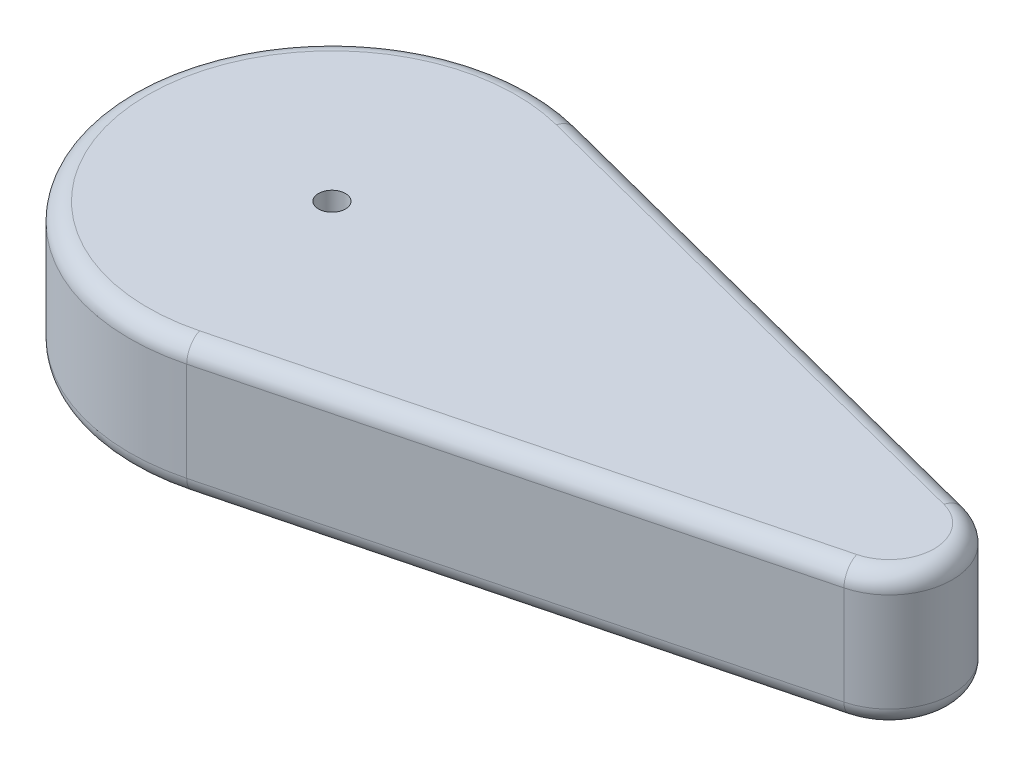
ISO-10303-21;
HEADER;
FILE_DESCRIPTION(('STEP AP214'),'2;1');
FILE_NAME('part.step','',(''),(''),'','','');
FILE_SCHEMA(('AUTOMOTIVE_DESIGN { 1 0 10303 214 1 1 1 1 }'));
ENDSEC;
DATA;
#1=APPLICATION_CONTEXT('core data for automotive mechanical design processes');
#2=APPLICATION_PROTOCOL_DEFINITION('international standard','automotive_design',2000,#1);
#3=PRODUCT_CONTEXT('',#1,'mechanical');
#4=PRODUCT('Part','Part','',(#3));
#5=PRODUCT_RELATED_PRODUCT_CATEGORY('part','',(#4));
#6=PRODUCT_DEFINITION_FORMATION('','',#4);
#7=PRODUCT_DEFINITION_CONTEXT('part definition',#1,'design');
#8=PRODUCT_DEFINITION('design','',#6,#7);
#9=PRODUCT_DEFINITION_SHAPE('','',#8);
#10=(LENGTH_UNIT() NAMED_UNIT(*) SI_UNIT(.MILLI.,.METRE.));
#11=(NAMED_UNIT(*) PLANE_ANGLE_UNIT() SI_UNIT($,.RADIAN.));
#12=(NAMED_UNIT(*) SI_UNIT($,.STERADIAN.) SOLID_ANGLE_UNIT());
#13=UNCERTAINTY_MEASURE_WITH_UNIT(LENGTH_MEASURE(1.E-05),#10,'distance_accuracy_value','');
#14=(GEOMETRIC_REPRESENTATION_CONTEXT(3) GLOBAL_UNCERTAINTY_ASSIGNED_CONTEXT((#13)) GLOBAL_UNIT_ASSIGNED_CONTEXT((#10,
#11,#12)) REPRESENTATION_CONTEXT('',''));
#15=CARTESIAN_POINT('',(0.,0.,0.));
#16=DIRECTION('',(0.,0.,1.));
#17=DIRECTION('',(1.,0.,0.));
#18=AXIS2_PLACEMENT_3D('',#15,#16,#17);
#19=CARTESIAN_POINT('',(0.,15.,0.));
#20=DIRECTION('',(0.,-1.,0.));
#21=DIRECTION('',(0.,0.,-1.));
#22=AXIS2_PLACEMENT_3D('',#19,#20,#21);
#23=CYLINDRICAL_SURFACE('',#22,1.5);
#24=CARTESIAN_POINT('',(0.,15.,0.));
#25=DIRECTION('',(0.,1.,0.));
#26=DIRECTION('',(0.,0.,1.));
#27=AXIS2_PLACEMENT_3D('',#24,#25,#26);
#28=CIRCLE('',#27,1.5);
#29=CARTESIAN_POINT('',(0.,15.,1.5));
#30=VERTEX_POINT('',#29);
#31=EDGE_CURVE('E312',#30,#30,#28,.T.);
#32=ORIENTED_EDGE('',*,*,#31,.T.);
#33=EDGE_LOOP('',(#32));
#34=FACE_BOUND('',#33,.T.);
#35=CARTESIAN_POINT('',(0.,7.,0.));
#36=DIRECTION('',(0.,-1.,0.));
#37=DIRECTION('',(0.,0.,-1.));
#38=AXIS2_PLACEMENT_3D('',#35,#36,#37);
#39=CIRCLE('',#38,1.5);
#40=CARTESIAN_POINT('',(0.,7.,-1.5));
#41=VERTEX_POINT('',#40);
#42=EDGE_CURVE('E204',#41,#41,#39,.F.);
#43=ORIENTED_EDGE('',*,*,#42,.F.);
#44=EDGE_LOOP('',(#43));
#45=FACE_BOUND('',#44,.T.);
#46=ADVANCED_FACE('F47',(#34,#45),#23,.F.);
#47=CARTESIAN_POINT('',(62.,15.,0.));
#48=DIRECTION('',(0.,-1.,0.));
#49=DIRECTION('',(0.,0.,-1.));
#50=AXIS2_PLACEMENT_3D('',#47,#48,#49);
#51=CYLINDRICAL_SURFACE('',#50,7.);
#52=DIRECTION('',(0.,-1.,0.));
#53=VECTOR('',#52,1.);
#54=CARTESIAN_POINT('',(63.75,15.,6.77772085586298));
#55=LINE('',#54,#53);
#56=CARTESIAN_POINT('',(63.75,13.,6.77772085586298));
#57=VERTEX_POINT('',#56);
#58=CARTESIAN_POINT('',(63.75,2.,6.77772085586298));
#59=VERTEX_POINT('',#58);
#60=EDGE_CURVE('E316',#57,#59,#55,.T.);
#61=ORIENTED_EDGE('',*,*,#60,.T.);
#62=CARTESIAN_POINT('',(62.,2.,0.));
#63=DIRECTION('',(0.,1.,0.));
#64=DIRECTION('',(0.,0.,1.));
#65=AXIS2_PLACEMENT_3D('',#62,#63,#64);
#66=CIRCLE('',#65,7.);
#67=CARTESIAN_POINT('',(63.75,2.,-6.77772085586298));
#68=VERTEX_POINT('',#67);
#69=EDGE_CURVE('E175',#59,#68,#66,.T.);
#70=ORIENTED_EDGE('',*,*,#69,.T.);
#71=DIRECTION('',(0.,-1.,0.));
#72=VECTOR('',#71,1.);
#73=CARTESIAN_POINT('',(63.75,15.,-6.77772085586298));
#74=LINE('',#73,#72);
#75=CARTESIAN_POINT('',(63.75,13.,-6.77772085586298));
#76=VERTEX_POINT('',#75);
#77=EDGE_CURVE('E188',#76,#68,#74,.T.);
#78=ORIENTED_EDGE('',*,*,#77,.F.);
#79=CARTESIAN_POINT('',(62.,13.,0.));
#80=DIRECTION('',(0.,1.,0.));
#81=DIRECTION('',(0.,0.,1.));
#82=AXIS2_PLACEMENT_3D('',#79,#80,#81);
#83=CIRCLE('',#82,7.);
#84=EDGE_CURVE('E339',#76,#57,#83,.F.);
#85=ORIENTED_EDGE('',*,*,#84,.T.);
#86=EDGE_LOOP('',(#61,#70,#78,#85));
#87=FACE_BOUND('',#86,.T.);
#88=ADVANCED_FACE('F410',(#87),#51,.T.);
#89=CARTESIAN_POINT('',(5.625,15.,-21.7855313224167));
#90=DIRECTION('',(-0.25,0.,0.968245836551854));
#91=DIRECTION('',(0.968245836551854,0.,0.25));
#92=AXIS2_PLACEMENT_3D('',#89,#90,#91);
#93=PLANE('',#92);
#94=ORIENTED_EDGE('',*,*,#77,.T.);
#95=DIRECTION('',(-0.968245836551854,0.,-0.25));
#96=VECTOR('',#95,1.);
#97=CARTESIAN_POINT('',(5.625,2.,-21.7855313224167));
#98=LINE('',#97,#96);
#99=CARTESIAN_POINT('',(5.625,2.,-21.7855313224167));
#100=VERTEX_POINT('',#99);
#101=EDGE_CURVE('E186',#68,#100,#98,.T.);
#102=ORIENTED_EDGE('',*,*,#101,.T.);
#103=DIRECTION('',(0.,-1.,0.));
#104=VECTOR('',#103,1.);
#105=CARTESIAN_POINT('',(5.625,15.,-21.7855313224167));
#106=LINE('',#105,#104);
#107=CARTESIAN_POINT('',(5.625,13.,-21.7855313224167));
#108=VERTEX_POINT('',#107);
#109=EDGE_CURVE('E166',#108,#100,#106,.T.);
#110=ORIENTED_EDGE('',*,*,#109,.F.);
#111=DIRECTION('',(-0.968245836551854,0.,-0.25));
#112=VECTOR('',#111,1.);
#113=CARTESIAN_POINT('',(63.75,13.,-6.77772085586298));
#114=LINE('',#113,#112);
#115=EDGE_CURVE('E183',#108,#76,#114,.F.);
#116=ORIENTED_EDGE('',*,*,#115,.T.);
#117=EDGE_LOOP('',(#94,#102,#110,#116));
#118=FACE_BOUND('',#117,.T.);
#119=ADVANCED_FACE('F182',(#118),#93,.F.);
#120=CARTESIAN_POINT('',(0.,15.,0.));
#121=DIRECTION('',(0.,-1.,0.));
#122=DIRECTION('',(0.,0.,-1.));
#123=AXIS2_PLACEMENT_3D('',#120,#121,#122);
#124=CYLINDRICAL_SURFACE('',#123,22.5);
#125=ORIENTED_EDGE('',*,*,#109,.T.);
#126=CARTESIAN_POINT('',(0.,2.,0.));
#127=DIRECTION('',(0.,1.,0.));
#128=DIRECTION('',(0.,0.,1.));
#129=AXIS2_PLACEMENT_3D('',#126,#127,#128);
#130=CIRCLE('',#129,22.5);
#131=CARTESIAN_POINT('',(5.625,2.,21.7855313224167));
#132=VERTEX_POINT('',#131);
#133=EDGE_CURVE('E174',#100,#132,#130,.T.);
#134=ORIENTED_EDGE('',*,*,#133,.T.);
#135=DIRECTION('',(0.,-1.,0.));
#136=VECTOR('',#135,1.);
#137=CARTESIAN_POINT('',(5.625,15.,21.7855313224167));
#138=LINE('',#137,#136);
#139=CARTESIAN_POINT('',(5.625,13.,21.7855313224167));
#140=VERTEX_POINT('',#139);
#141=EDGE_CURVE('E168',#140,#132,#138,.T.);
#142=ORIENTED_EDGE('',*,*,#141,.F.);
#143=CARTESIAN_POINT('',(0.,13.,0.));
#144=DIRECTION('',(0.,1.,0.));
#145=DIRECTION('',(0.,0.,1.));
#146=AXIS2_PLACEMENT_3D('',#143,#144,#145);
#147=CIRCLE('',#146,22.5);
#148=EDGE_CURVE('E163',#140,#108,#147,.F.);
#149=ORIENTED_EDGE('',*,*,#148,.T.);
#150=EDGE_LOOP('',(#125,#134,#142,#149));
#151=FACE_BOUND('',#150,.T.);
#152=ADVANCED_FACE('F165',(#151),#124,.T.);
#153=CARTESIAN_POINT('',(5.625,15.,21.7855313224167));
#154=DIRECTION('',(0.25,0.,0.968245836551854));
#155=DIRECTION('',(0.968245836551854,0.,-0.25));
#156=AXIS2_PLACEMENT_3D('',#153,#154,#155);
#157=PLANE('',#156);
#158=ORIENTED_EDGE('',*,*,#141,.T.);
#159=DIRECTION('',(-0.968245836551854,0.,0.25));
#160=VECTOR('',#159,1.);
#161=CARTESIAN_POINT('',(63.75,2.,6.77772085586298));
#162=LINE('',#161,#160);
#163=EDGE_CURVE('E349',#132,#59,#162,.F.);
#164=ORIENTED_EDGE('',*,*,#163,.T.);
#165=ORIENTED_EDGE('',*,*,#60,.F.);
#166=DIRECTION('',(-0.968245836551854,0.,0.25));
#167=VECTOR('',#166,1.);
#168=CARTESIAN_POINT('',(5.625,13.,21.7855313224167));
#169=LINE('',#168,#167);
#170=EDGE_CURVE('E346',#57,#140,#169,.T.);
#171=ORIENTED_EDGE('',*,*,#170,.T.);
#172=EDGE_LOOP('',(#158,#164,#165,#171));
#173=FACE_BOUND('',#172,.T.);
#174=ADVANCED_FACE('F391',(#173),#157,.T.);
#175=CARTESIAN_POINT('',(0.,15.,0.));
#176=DIRECTION('',(0.,1.,0.));
#177=DIRECTION('',(0.,0.,1.));
#178=AXIS2_PLACEMENT_3D('',#175,#176,#177);
#179=PLANE('',#178);
#180=CARTESIAN_POINT('',(62.,15.,0.));
#181=DIRECTION('',(0.,1.,0.));
#182=DIRECTION('',(0.,0.,1.));
#183=AXIS2_PLACEMENT_3D('',#180,#181,#182);
#184=CIRCLE('',#183,5.);
#185=CARTESIAN_POINT('',(63.25,15.,4.84122918275927));
#186=VERTEX_POINT('',#185);
#187=CARTESIAN_POINT('',(63.25,15.,-4.84122918275927));
#188=VERTEX_POINT('',#187);
#189=EDGE_CURVE('E357',#186,#188,#184,.T.);
#190=ORIENTED_EDGE('',*,*,#189,.T.);
#191=DIRECTION('',(-0.968245836551854,0.,-0.25));
#192=VECTOR('',#191,1.);
#193=CARTESIAN_POINT('',(5.125,15.,-19.849039649313));
#194=LINE('',#193,#192);
#195=CARTESIAN_POINT('',(5.125,15.,-19.849039649313));
#196=VERTEX_POINT('',#195);
#197=EDGE_CURVE('E228',#188,#196,#194,.T.);
#198=ORIENTED_EDGE('',*,*,#197,.T.);
#199=CARTESIAN_POINT('',(0.,15.,0.));
#200=DIRECTION('',(0.,1.,0.));
#201=DIRECTION('',(0.,0.,1.));
#202=AXIS2_PLACEMENT_3D('',#199,#200,#201);
#203=CIRCLE('',#202,20.5);
#204=CARTESIAN_POINT('',(5.125,15.,19.849039649313));
#205=VERTEX_POINT('',#204);
#206=EDGE_CURVE('E201',#196,#205,#203,.T.);
#207=ORIENTED_EDGE('',*,*,#206,.T.);
#208=DIRECTION('',(-0.968245836551854,0.,0.25));
#209=VECTOR('',#208,1.);
#210=CARTESIAN_POINT('',(5.125,15.,19.849039649313));
#211=LINE('',#210,#209);
#212=EDGE_CURVE('E354',#205,#186,#211,.F.);
#213=ORIENTED_EDGE('',*,*,#212,.T.);
#214=EDGE_LOOP('',(#190,#198,#207,#213));
#215=FACE_BOUND('',#214,.T.);
#216=ORIENTED_EDGE('',*,*,#31,.F.);
#217=EDGE_LOOP('',(#216));
#218=FACE_BOUND('',#217,.T.);
#219=ADVANCED_FACE('F402',(#215,#218),#179,.T.);
#220=CARTESIAN_POINT('',(0.,0.,0.));
#221=DIRECTION('',(0.,1.,0.));
#222=DIRECTION('',(0.,0.,1.));
#223=AXIS2_PLACEMENT_3D('',#220,#221,#222);
#224=PLANE('',#223);
#225=CARTESIAN_POINT('',(0.,0.,0.));
#226=DIRECTION('',(0.,-1.,0.));
#227=DIRECTION('',(0.,0.,-1.));
#228=AXIS2_PLACEMENT_3D('',#225,#226,#227);
#229=CIRCLE('',#228,8.);
#230=CARTESIAN_POINT('',(5.64702478203247,0.,5.66666666666667));
#231=VERTEX_POINT('',#230);
#232=CARTESIAN_POINT('',(5.64702478203247,0.,-5.66666666666667));
#233=VERTEX_POINT('',#232);
#234=EDGE_CURVE('E286',#231,#233,#229,.T.);
#235=ORIENTED_EDGE('',*,*,#234,.F.);
#236=CARTESIAN_POINT('',(8.47053717304871,0.,8.5));
#237=DIRECTION('',(0.,1.,0.));
#238=DIRECTION('',(0.,0.,1.));
#239=AXIS2_PLACEMENT_3D('',#236,#237,#238);
#240=CIRCLE('',#239,4.);
#241=CARTESIAN_POINT('',(8.47053717304871,0.,4.5));
#242=VERTEX_POINT('',#241);
#243=EDGE_CURVE('E235',#231,#242,#240,.F.);
#244=ORIENTED_EDGE('',*,*,#243,.T.);
#245=DIRECTION('',(1.,0.,0.));
#246=VECTOR('',#245,1.);
#247=CARTESIAN_POINT('',(0.,0.,4.5));
#248=LINE('',#247,#246);
#249=CARTESIAN_POINT('',(23.5,0.,4.5));
#250=VERTEX_POINT('',#249);
#251=EDGE_CURVE('E308',#242,#250,#248,.T.);
#252=ORIENTED_EDGE('',*,*,#251,.T.);
#253=CARTESIAN_POINT('',(23.5,0.,0.5));
#254=DIRECTION('',(0.,1.,0.));
#255=DIRECTION('',(0.,0.,1.));
#256=AXIS2_PLACEMENT_3D('',#253,#254,#255);
#257=CIRCLE('',#256,4.);
#258=CARTESIAN_POINT('',(27.5,0.,0.5));
#259=VERTEX_POINT('',#258);
#260=EDGE_CURVE('E11',#250,#259,#257,.T.);
#261=ORIENTED_EDGE('',*,*,#260,.T.);
#262=DIRECTION('',(0.,0.,-1.));
#263=VECTOR('',#262,1.);
#264=CARTESIAN_POINT('',(27.5,0.,0.));
#265=LINE('',#264,#263);
#266=CARTESIAN_POINT('',(27.5,0.,-0.5));
#267=VERTEX_POINT('',#266);
#268=EDGE_CURVE('E277',#259,#267,#265,.T.);
#269=ORIENTED_EDGE('',*,*,#268,.T.);
#270=CARTESIAN_POINT('',(23.5,0.,-0.5));
#271=DIRECTION('',(0.,1.,0.));
#272=DIRECTION('',(0.,0.,1.));
#273=AXIS2_PLACEMENT_3D('',#270,#271,#272);
#274=CIRCLE('',#273,4.);
#275=CARTESIAN_POINT('',(23.5,0.,-4.5));
#276=VERTEX_POINT('',#275);
#277=EDGE_CURVE('E56',#267,#276,#274,.T.);
#278=ORIENTED_EDGE('',*,*,#277,.T.);
#279=DIRECTION('',(1.,0.,0.));
#280=VECTOR('',#279,1.);
#281=CARTESIAN_POINT('',(0.,0.,-4.5));
#282=LINE('',#281,#280);
#283=CARTESIAN_POINT('',(8.47053717304871,0.,-4.5));
#284=VERTEX_POINT('',#283);
#285=EDGE_CURVE('E276',#284,#276,#282,.T.);
#286=ORIENTED_EDGE('',*,*,#285,.F.);
#287=CARTESIAN_POINT('',(8.47053717304871,0.,-8.5));
#288=DIRECTION('',(0.,1.,0.));
#289=DIRECTION('',(0.,0.,1.));
#290=AXIS2_PLACEMENT_3D('',#287,#288,#289);
#291=CIRCLE('',#290,4.);
#292=EDGE_CURVE('E232',#284,#233,#291,.F.);
#293=ORIENTED_EDGE('',*,*,#292,.T.);
#294=EDGE_LOOP('',(#235,#244,#252,#261,#269,#278,#286,#293));
#295=FACE_BOUND('',#294,.T.);
#296=CARTESIAN_POINT('',(0.,0.,0.));
#297=DIRECTION('',(0.,1.,0.));
#298=DIRECTION('',(0.,0.,1.));
#299=AXIS2_PLACEMENT_3D('',#296,#297,#298);
#300=CIRCLE('',#299,20.5);
#301=CARTESIAN_POINT('',(5.125,0.,19.849039649313));
#302=VERTEX_POINT('',#301);
#303=CARTESIAN_POINT('',(5.125,0.,-19.849039649313));
#304=VERTEX_POINT('',#303);
#305=EDGE_CURVE('E329',#302,#304,#300,.F.);
#306=ORIENTED_EDGE('',*,*,#305,.T.);
#307=DIRECTION('',(-0.968245836551854,0.,-0.25));
#308=VECTOR('',#307,1.);
#309=CARTESIAN_POINT('',(5.125,0.,-19.849039649313));
#310=LINE('',#309,#308);
#311=CARTESIAN_POINT('',(63.25,0.,-4.84122918275927));
#312=VERTEX_POINT('',#311);
#313=EDGE_CURVE('E335',#304,#312,#310,.F.);
#314=ORIENTED_EDGE('',*,*,#313,.T.);
#315=CARTESIAN_POINT('',(62.,0.,0.));
#316=DIRECTION('',(0.,1.,0.));
#317=DIRECTION('',(0.,0.,1.));
#318=AXIS2_PLACEMENT_3D('',#315,#316,#317);
#319=CIRCLE('',#318,5.);
#320=CARTESIAN_POINT('',(63.25,0.,4.84122918275926));
#321=VERTEX_POINT('',#320);
#322=EDGE_CURVE('E332',#312,#321,#319,.F.);
#323=ORIENTED_EDGE('',*,*,#322,.T.);
#324=DIRECTION('',(-0.968245836551854,0.,0.25));
#325=VECTOR('',#324,1.);
#326=CARTESIAN_POINT('',(5.125,0.,19.849039649313));
#327=LINE('',#326,#325);
#328=EDGE_CURVE('E326',#321,#302,#327,.T.);
#329=ORIENTED_EDGE('',*,*,#328,.T.);
#330=EDGE_LOOP('',(#306,#314,#323,#329));
#331=FACE_BOUND('',#330,.T.);
#332=ADVANCED_FACE('F274',(#295,#331),#224,.F.);
#333=CARTESIAN_POINT('',(5.125,2.,19.849039649313));
#334=DIRECTION('',(0.968245836551854,0.,-0.25));
#335=DIRECTION('',(-0.25,0.,-0.968245836551854));
#336=AXIS2_PLACEMENT_3D('',#333,#334,#335);
#337=CYLINDRICAL_SURFACE('',#336,2.);
#338=CARTESIAN_POINT('',(5.125,2.,19.849039649313));
#339=DIRECTION('',(-0.968245836551854,0.,0.25));
#340=DIRECTION('',(0.25,0.,0.968245836551854));
#341=AXIS2_PLACEMENT_3D('',#338,#339,#340);
#342=CIRCLE('',#341,2.);
#343=EDGE_CURVE('E366',#302,#132,#342,.T.);
#344=ORIENTED_EDGE('',*,*,#343,.F.);
#345=ORIENTED_EDGE('',*,*,#328,.F.);
#346=CARTESIAN_POINT('',(63.25,2.,4.84122918275927));
#347=DIRECTION('',(0.968245836551854,0.,-0.25));
#348=DIRECTION('',(-0.25,0.,-0.968245836551854));
#349=AXIS2_PLACEMENT_3D('',#346,#347,#348);
#350=CIRCLE('',#349,2.);
#351=EDGE_CURVE('E214',#59,#321,#350,.T.);
#352=ORIENTED_EDGE('',*,*,#351,.F.);
#353=ORIENTED_EDGE('',*,*,#163,.F.);
#354=EDGE_LOOP('',(#344,#345,#352,#353));
#355=FACE_BOUND('',#354,.T.);
#356=ADVANCED_FACE('F384',(#355),#337,.T.);
#357=CARTESIAN_POINT('',(62.,2.,0.));
#358=DIRECTION('',(0.,1.,0.));
#359=DIRECTION('',(0.,0.,1.));
#360=AXIS2_PLACEMENT_3D('',#357,#358,#359);
#361=TOROIDAL_SURFACE('',#360,5.,2.);
#362=ORIENTED_EDGE('',*,*,#351,.T.);
#363=ORIENTED_EDGE('',*,*,#322,.F.);
#364=CARTESIAN_POINT('',(63.25,2.,-4.84122918275927));
#365=DIRECTION('',(-0.968245836551854,0.,-0.25));
#366=DIRECTION('',(-0.25,0.,0.968245836551854));
#367=AXIS2_PLACEMENT_3D('',#364,#365,#366);
#368=CIRCLE('',#367,2.);
#369=EDGE_CURVE('E364',#68,#312,#368,.T.);
#370=ORIENTED_EDGE('',*,*,#369,.F.);
#371=ORIENTED_EDGE('',*,*,#69,.F.);
#372=EDGE_LOOP('',(#362,#363,#370,#371));
#373=FACE_BOUND('',#372,.T.);
#374=ADVANCED_FACE('F379',(#373),#361,.T.);
#375=CARTESIAN_POINT('',(0.,2.,0.));
#376=DIRECTION('',(0.,1.,0.));
#377=DIRECTION('',(0.,0.,1.));
#378=AXIS2_PLACEMENT_3D('',#375,#376,#377);
#379=TOROIDAL_SURFACE('',#378,20.5,2.);
#380=ORIENTED_EDGE('',*,*,#343,.T.);
#381=ORIENTED_EDGE('',*,*,#133,.F.);
#382=CARTESIAN_POINT('',(5.125,2.,-19.849039649313));
#383=DIRECTION('',(0.968245836551854,0.,0.25));
#384=DIRECTION('',(0.25,0.,-0.968245836551854));
#385=AXIS2_PLACEMENT_3D('',#382,#383,#384);
#386=CIRCLE('',#385,2.);
#387=EDGE_CURVE('E223',#304,#100,#386,.T.);
#388=ORIENTED_EDGE('',*,*,#387,.F.);
#389=ORIENTED_EDGE('',*,*,#305,.F.);
#390=EDGE_LOOP('',(#380,#381,#388,#389));
#391=FACE_BOUND('',#390,.T.);
#392=ADVANCED_FACE('F389',(#391),#379,.T.);
#393=CARTESIAN_POINT('',(5.125,2.,-19.849039649313));
#394=DIRECTION('',(-0.968245836551854,0.,-0.25));
#395=DIRECTION('',(-0.25,0.,0.968245836551854));
#396=AXIS2_PLACEMENT_3D('',#393,#394,#395);
#397=CYLINDRICAL_SURFACE('',#396,2.);
#398=ORIENTED_EDGE('',*,*,#369,.T.);
#399=ORIENTED_EDGE('',*,*,#313,.F.);
#400=ORIENTED_EDGE('',*,*,#387,.T.);
#401=ORIENTED_EDGE('',*,*,#101,.F.);
#402=EDGE_LOOP('',(#398,#399,#400,#401));
#403=FACE_BOUND('',#402,.T.);
#404=ADVANCED_FACE('F388',(#403),#397,.T.);
#405=CARTESIAN_POINT('',(5.125,13.,19.849039649313));
#406=DIRECTION('',(-0.968245836551854,0.,0.25));
#407=DIRECTION('',(0.25,0.,0.968245836551854));
#408=AXIS2_PLACEMENT_3D('',#405,#406,#407);
#409=CYLINDRICAL_SURFACE('',#408,2.);
#410=CARTESIAN_POINT('',(5.125,13.,19.849039649313));
#411=DIRECTION('',(-0.968245836551854,0.,0.25));
#412=DIRECTION('',(0.25,0.,0.968245836551854));
#413=AXIS2_PLACEMENT_3D('',#410,#411,#412);
#414=CIRCLE('',#413,2.);
#415=EDGE_CURVE('E208',#140,#205,#414,.T.);
#416=ORIENTED_EDGE('',*,*,#415,.F.);
#417=ORIENTED_EDGE('',*,*,#170,.F.);
#418=CARTESIAN_POINT('',(63.25,13.,4.84122918275927));
#419=DIRECTION('',(0.968245836551854,0.,-0.25));
#420=DIRECTION('',(-0.25,0.,-0.968245836551854));
#421=AXIS2_PLACEMENT_3D('',#418,#419,#420);
#422=CIRCLE('',#421,2.);
#423=EDGE_CURVE('E219',#186,#57,#422,.T.);
#424=ORIENTED_EDGE('',*,*,#423,.F.);
#425=ORIENTED_EDGE('',*,*,#212,.F.);
#426=EDGE_LOOP('',(#416,#417,#424,#425));
#427=FACE_BOUND('',#426,.T.);
#428=ADVANCED_FACE('F396',(#427),#409,.T.);
#429=CARTESIAN_POINT('',(62.,13.,0.));
#430=DIRECTION('',(0.,1.,0.));
#431=DIRECTION('',(0.,0.,1.));
#432=AXIS2_PLACEMENT_3D('',#429,#430,#431);
#433=TOROIDAL_SURFACE('',#432,5.,2.);
#434=ORIENTED_EDGE('',*,*,#423,.T.);
#435=ORIENTED_EDGE('',*,*,#84,.F.);
#436=CARTESIAN_POINT('',(63.25,13.,-4.84122918275927));
#437=DIRECTION('',(-0.968245836551854,0.,-0.25));
#438=DIRECTION('',(-0.25,0.,0.968245836551854));
#439=AXIS2_PLACEMENT_3D('',#436,#437,#438);
#440=CIRCLE('',#439,2.);
#441=EDGE_CURVE('E196',#188,#76,#440,.T.);
#442=ORIENTED_EDGE('',*,*,#441,.F.);
#443=ORIENTED_EDGE('',*,*,#189,.F.);
#444=EDGE_LOOP('',(#434,#435,#442,#443));
#445=FACE_BOUND('',#444,.T.);
#446=ADVANCED_FACE('F400',(#445),#433,.T.);
#447=CARTESIAN_POINT('',(0.,13.,0.));
#448=DIRECTION('',(0.,1.,0.));
#449=DIRECTION('',(0.,0.,1.));
#450=AXIS2_PLACEMENT_3D('',#447,#448,#449);
#451=TOROIDAL_SURFACE('',#450,20.5,2.);
#452=ORIENTED_EDGE('',*,*,#415,.T.);
#453=ORIENTED_EDGE('',*,*,#206,.F.);
#454=CARTESIAN_POINT('',(5.125,13.,-19.849039649313));
#455=DIRECTION('',(0.968245836551854,0.,0.25));
#456=DIRECTION('',(0.25,0.,-0.968245836551854));
#457=AXIS2_PLACEMENT_3D('',#454,#455,#456);
#458=CIRCLE('',#457,2.);
#459=EDGE_CURVE('E193',#108,#196,#458,.T.);
#460=ORIENTED_EDGE('',*,*,#459,.F.);
#461=ORIENTED_EDGE('',*,*,#148,.F.);
#462=EDGE_LOOP('',(#452,#453,#460,#461));
#463=FACE_BOUND('',#462,.T.);
#464=ADVANCED_FACE('F200',(#463),#451,.T.);
#465=CARTESIAN_POINT('',(5.125,13.,-19.849039649313));
#466=DIRECTION('',(0.968245836551854,0.,0.25));
#467=DIRECTION('',(0.25,0.,-0.968245836551854));
#468=AXIS2_PLACEMENT_3D('',#465,#466,#467);
#469=CYLINDRICAL_SURFACE('',#468,2.);
#470=ORIENTED_EDGE('',*,*,#441,.T.);
#471=ORIENTED_EDGE('',*,*,#115,.F.);
#472=ORIENTED_EDGE('',*,*,#459,.T.);
#473=ORIENTED_EDGE('',*,*,#197,.F.);
#474=EDGE_LOOP('',(#470,#471,#472,#473));
#475=FACE_BOUND('',#474,.T.);
#476=ADVANCED_FACE('F191',(#475),#469,.T.);
#477=CARTESIAN_POINT('',(0.,7.,0.));
#478=DIRECTION('',(0.,-1.,0.));
#479=DIRECTION('',(0.,0.,-1.));
#480=AXIS2_PLACEMENT_3D('',#477,#478,#479);
#481=CYLINDRICAL_SURFACE('',#480,8.);
#482=CARTESIAN_POINT('',(0.,7.,0.));
#483=DIRECTION('',(0.,-1.,0.));
#484=DIRECTION('',(0.,0.,-1.));
#485=AXIS2_PLACEMENT_3D('',#482,#483,#484);
#486=CIRCLE('',#485,8.);
#487=CARTESIAN_POINT('',(5.64702478203247,7.,5.66666666666667));
#488=VERTEX_POINT('',#487);
#489=CARTESIAN_POINT('',(5.64702478203247,7.,-5.66666666666667));
#490=VERTEX_POINT('',#489);
#491=EDGE_CURVE('E299',#488,#490,#486,.T.);
#492=ORIENTED_EDGE('',*,*,#491,.F.);
#493=DIRECTION('',(0.,-1.,0.));
#494=VECTOR('',#493,1.);
#495=CARTESIAN_POINT('',(5.64702478203247,7.,5.66666666666667));
#496=LINE('',#495,#494);
#497=EDGE_CURVE('E227',#488,#231,#496,.T.);
#498=ORIENTED_EDGE('',*,*,#497,.T.);
#499=ORIENTED_EDGE('',*,*,#234,.T.);
#500=DIRECTION('',(0.,-1.,0.));
#501=VECTOR('',#500,1.);
#502=CARTESIAN_POINT('',(5.64702478203247,7.,-5.66666666666667));
#503=LINE('',#502,#501);
#504=EDGE_CURVE('E224',#233,#490,#503,.F.);
#505=ORIENTED_EDGE('',*,*,#504,.T.);
#506=EDGE_LOOP('',(#492,#498,#499,#505));
#507=FACE_BOUND('',#506,.T.);
#508=ADVANCED_FACE('F430',(#507),#481,.F.);
#509=CARTESIAN_POINT('',(0.,7.,4.5));
#510=DIRECTION('',(0.,0.,-1.));
#511=DIRECTION('',(-1.,0.,0.));
#512=AXIS2_PLACEMENT_3D('',#509,#510,#511);
#513=PLANE('',#512);
#514=ORIENTED_EDGE('',*,*,#251,.F.);
#515=DIRECTION('',(0.,1.,0.));
#516=VECTOR('',#515,1.);
#517=CARTESIAN_POINT('',(8.47053717304871,7.,4.5));
#518=LINE('',#517,#516);
#519=CARTESIAN_POINT('',(8.47053717304871,7.,4.5));
#520=VERTEX_POINT('',#519);
#521=EDGE_CURVE('E242',#242,#520,#518,.T.);
#522=ORIENTED_EDGE('',*,*,#521,.T.);
#523=DIRECTION('',(1.,0.,0.));
#524=VECTOR('',#523,1.);
#525=CARTESIAN_POINT('',(0.,7.,4.5));
#526=LINE('',#525,#524);
#527=CARTESIAN_POINT('',(23.5,7.,4.5));
#528=VERTEX_POINT('',#527);
#529=EDGE_CURVE('E211',#520,#528,#526,.T.);
#530=ORIENTED_EDGE('',*,*,#529,.T.);
#531=DIRECTION('',(0.,-1.,0.));
#532=VECTOR('',#531,1.);
#533=CARTESIAN_POINT('',(23.5,0.,4.5));
#534=LINE('',#533,#532);
#535=EDGE_CURVE('E238',#528,#250,#534,.T.);
#536=ORIENTED_EDGE('',*,*,#535,.T.);
#537=EDGE_LOOP('',(#514,#522,#530,#536));
#538=FACE_BOUND('',#537,.T.);
#539=ADVANCED_FACE('F427',(#538),#513,.T.);
#540=CARTESIAN_POINT('',(27.5,7.,0.));
#541=DIRECTION('',(-1.,0.,0.));
#542=DIRECTION('',(0.,0.,1.));
#543=AXIS2_PLACEMENT_3D('',#540,#541,#542);
#544=PLANE('',#543);
#545=DIRECTION('',(0.,0.,-1.));
#546=VECTOR('',#545,1.);
#547=CARTESIAN_POINT('',(27.5,7.,0.));
#548=LINE('',#547,#546);
#549=CARTESIAN_POINT('',(27.5,7.,0.5));
#550=VERTEX_POINT('',#549);
#551=CARTESIAN_POINT('',(27.5,7.,-0.5));
#552=VERTEX_POINT('',#551);
#553=EDGE_CURVE('E290',#550,#552,#548,.T.);
#554=ORIENTED_EDGE('',*,*,#553,.T.);
#555=DIRECTION('',(0.,-1.,0.));
#556=VECTOR('',#555,1.);
#557=CARTESIAN_POINT('',(27.5,7.,-0.5));
#558=LINE('',#557,#556);
#559=EDGE_CURVE('E254',#552,#267,#558,.T.);
#560=ORIENTED_EDGE('',*,*,#559,.T.);
#561=ORIENTED_EDGE('',*,*,#268,.F.);
#562=DIRECTION('',(0.,-1.,0.));
#563=VECTOR('',#562,1.);
#564=CARTESIAN_POINT('',(27.5,7.,0.5));
#565=LINE('',#564,#563);
#566=EDGE_CURVE('E70',#259,#550,#565,.F.);
#567=ORIENTED_EDGE('',*,*,#566,.T.);
#568=EDGE_LOOP('',(#554,#560,#561,#567));
#569=FACE_BOUND('',#568,.T.);
#570=ADVANCED_FACE('F289',(#569),#544,.T.);
#571=CARTESIAN_POINT('',(0.,7.,-4.5));
#572=DIRECTION('',(0.,0.,-1.));
#573=DIRECTION('',(-1.,0.,0.));
#574=AXIS2_PLACEMENT_3D('',#571,#572,#573);
#575=PLANE('',#574);
#576=DIRECTION('',(1.,0.,0.));
#577=VECTOR('',#576,1.);
#578=CARTESIAN_POINT('',(0.,7.,-4.5));
#579=LINE('',#578,#577);
#580=CARTESIAN_POINT('',(8.47053717304871,7.,-4.5));
#581=VERTEX_POINT('',#580);
#582=CARTESIAN_POINT('',(23.5,7.,-4.5));
#583=VERTEX_POINT('',#582);
#584=EDGE_CURVE('E293',#581,#583,#579,.T.);
#585=ORIENTED_EDGE('',*,*,#584,.F.);
#586=DIRECTION('',(0.,-1.,0.));
#587=VECTOR('',#586,1.);
#588=CARTESIAN_POINT('',(8.47053717304871,7.,-4.5));
#589=LINE('',#588,#587);
#590=EDGE_CURVE('E248',#581,#284,#589,.T.);
#591=ORIENTED_EDGE('',*,*,#590,.T.);
#592=ORIENTED_EDGE('',*,*,#285,.T.);
#593=DIRECTION('',(0.,-1.,0.));
#594=VECTOR('',#593,1.);
#595=CARTESIAN_POINT('',(23.5,7.,-4.5));
#596=LINE('',#595,#594);
#597=EDGE_CURVE('E245',#276,#583,#596,.F.);
#598=ORIENTED_EDGE('',*,*,#597,.T.);
#599=EDGE_LOOP('',(#585,#591,#592,#598));
#600=FACE_BOUND('',#599,.T.);
#601=ADVANCED_FACE('F283',(#600),#575,.F.);
#602=CARTESIAN_POINT('',(0.,7.,0.));
#603=DIRECTION('',(0.,-1.,0.));
#604=DIRECTION('',(0.,0.,-1.));
#605=AXIS2_PLACEMENT_3D('',#602,#603,#604);
#606=PLANE('',#605);
#607=ORIENTED_EDGE('',*,*,#584,.T.);
#608=CARTESIAN_POINT('',(23.5,7.,-0.5));
#609=DIRECTION('',(0.,-1.,0.));
#610=DIRECTION('',(0.,0.,-1.));
#611=AXIS2_PLACEMENT_3D('',#608,#609,#610);
#612=CIRCLE('',#611,4.);
#613=EDGE_CURVE('E63',#583,#552,#612,.T.);
#614=ORIENTED_EDGE('',*,*,#613,.T.);
#615=ORIENTED_EDGE('',*,*,#553,.F.);
#616=CARTESIAN_POINT('',(23.5,7.,0.5));
#617=DIRECTION('',(0.,-1.,0.));
#618=DIRECTION('',(0.,0.,-1.));
#619=AXIS2_PLACEMENT_3D('',#616,#617,#618);
#620=CIRCLE('',#619,4.);
#621=EDGE_CURVE('E258',#550,#528,#620,.T.);
#622=ORIENTED_EDGE('',*,*,#621,.T.);
#623=ORIENTED_EDGE('',*,*,#529,.F.);
#624=CARTESIAN_POINT('',(8.47053717304871,7.,8.5));
#625=DIRECTION('',(0.,-1.,0.));
#626=DIRECTION('',(0.,0.,-1.));
#627=AXIS2_PLACEMENT_3D('',#624,#625,#626);
#628=CIRCLE('',#627,4.);
#629=EDGE_CURVE('E263',#520,#488,#628,.F.);
#630=ORIENTED_EDGE('',*,*,#629,.T.);
#631=ORIENTED_EDGE('',*,*,#491,.T.);
#632=CARTESIAN_POINT('',(8.47053717304871,7.,-8.5));
#633=DIRECTION('',(0.,-1.,0.));
#634=DIRECTION('',(0.,0.,-1.));
#635=AXIS2_PLACEMENT_3D('',#632,#633,#634);
#636=CIRCLE('',#635,4.);
#637=EDGE_CURVE('E266',#490,#581,#636,.F.);
#638=ORIENTED_EDGE('',*,*,#637,.T.);
#639=EDGE_LOOP('',(#607,#614,#615,#622,#623,#630,#631,#638));
#640=FACE_BOUND('',#639,.T.);
#641=ORIENTED_EDGE('',*,*,#42,.T.);
#642=EDGE_LOOP('',(#641));
#643=FACE_BOUND('',#642,.T.);
#644=ADVANCED_FACE('F414',(#640,#643),#606,.T.);
#645=CARTESIAN_POINT('',(8.47053717304871,7.,8.5));
#646=DIRECTION('',(0.,-1.,0.));
#647=DIRECTION('',(0.,0.,-1.));
#648=AXIS2_PLACEMENT_3D('',#645,#646,#647);
#649=CYLINDRICAL_SURFACE('',#648,4.);
#650=ORIENTED_EDGE('',*,*,#629,.F.);
#651=ORIENTED_EDGE('',*,*,#521,.F.);
#652=ORIENTED_EDGE('',*,*,#243,.F.);
#653=ORIENTED_EDGE('',*,*,#497,.F.);
#654=EDGE_LOOP('',(#650,#651,#652,#653));
#655=FACE_BOUND('',#654,.T.);
#656=ADVANCED_FACE('F416',(#655),#649,.T.);
#657=CARTESIAN_POINT('',(8.47053717304871,7.,-8.5));
#658=DIRECTION('',(0.,-1.,0.));
#659=DIRECTION('',(0.,0.,-1.));
#660=AXIS2_PLACEMENT_3D('',#657,#658,#659);
#661=CYLINDRICAL_SURFACE('',#660,4.);
#662=ORIENTED_EDGE('',*,*,#637,.F.);
#663=ORIENTED_EDGE('',*,*,#504,.F.);
#664=ORIENTED_EDGE('',*,*,#292,.F.);
#665=ORIENTED_EDGE('',*,*,#590,.F.);
#666=EDGE_LOOP('',(#662,#663,#664,#665));
#667=FACE_BOUND('',#666,.T.);
#668=ADVANCED_FACE('F422',(#667),#661,.T.);
#669=CARTESIAN_POINT('',(23.5,7.,-0.5));
#670=DIRECTION('',(0.,-1.,0.));
#671=DIRECTION('',(0.,0.,-1.));
#672=AXIS2_PLACEMENT_3D('',#669,#670,#671);
#673=CYLINDRICAL_SURFACE('',#672,4.);
#674=ORIENTED_EDGE('',*,*,#613,.F.);
#675=ORIENTED_EDGE('',*,*,#597,.F.);
#676=ORIENTED_EDGE('',*,*,#277,.F.);
#677=ORIENTED_EDGE('',*,*,#559,.F.);
#678=EDGE_LOOP('',(#674,#675,#676,#677));
#679=FACE_BOUND('',#678,.T.);
#680=ADVANCED_FACE('F288',(#679),#673,.F.);
#681=CARTESIAN_POINT('',(23.5,7.,0.5));
#682=DIRECTION('',(0.,1.,0.));
#683=DIRECTION('',(0.,0.,1.));
#684=AXIS2_PLACEMENT_3D('',#681,#682,#683);
#685=CYLINDRICAL_SURFACE('',#684,4.);
#686=ORIENTED_EDGE('',*,*,#621,.F.);
#687=ORIENTED_EDGE('',*,*,#566,.F.);
#688=ORIENTED_EDGE('',*,*,#260,.F.);
#689=ORIENTED_EDGE('',*,*,#535,.F.);
#690=EDGE_LOOP('',(#686,#687,#688,#689));
#691=FACE_BOUND('',#690,.T.);
#692=ADVANCED_FACE('F49',(#691),#685,.F.);
#693=CLOSED_SHELL('',(#46,#88,#119,#152,#174,#219,#332,#356,#374,#392,#404,#428,#446,#464,#476,
#508,#539,#570,#601,#644,#656,#668,#680,#692));
#694=MANIFOLD_SOLID_BREP('B2',#693);
#695=ADVANCED_BREP_SHAPE_REPRESENTATION('',(#18,#694),#14);
#696=SHAPE_DEFINITION_REPRESENTATION(#9,#695);
ENDSEC;
END-ISO-10303-21;
